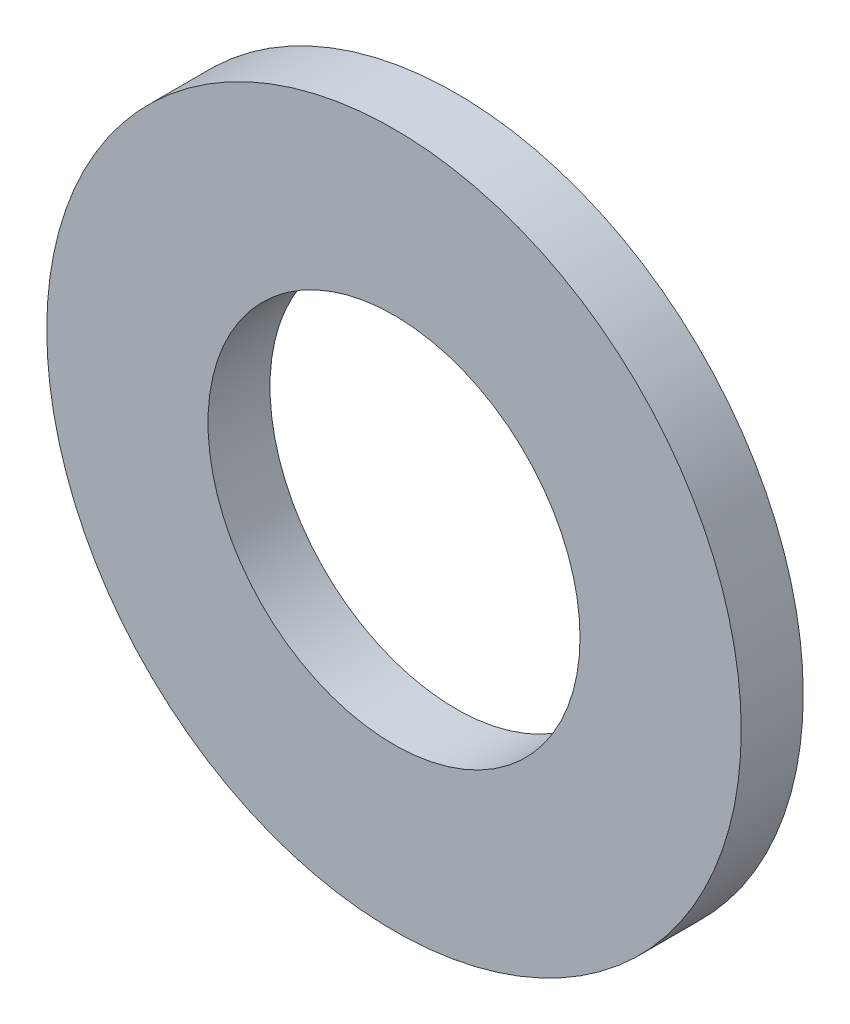
ISO-10303-21;
HEADER;
FILE_DESCRIPTION(('STEP AP214'),'2;1');
FILE_NAME('part.step','',(''),(''),'','','');
FILE_SCHEMA(('AUTOMOTIVE_DESIGN { 1 0 10303 214 1 1 1 1 }'));
ENDSEC;
DATA;
#1=APPLICATION_CONTEXT('core data for automotive mechanical design processes');
#2=APPLICATION_PROTOCOL_DEFINITION('international standard','automotive_design',2000,#1);
#3=PRODUCT_CONTEXT('',#1,'mechanical');
#4=PRODUCT('Part','Part','',(#3));
#5=PRODUCT_RELATED_PRODUCT_CATEGORY('part','',(#4));
#6=PRODUCT_DEFINITION_FORMATION('','',#4);
#7=PRODUCT_DEFINITION_CONTEXT('part definition',#1,'design');
#8=PRODUCT_DEFINITION('design','',#6,#7);
#9=PRODUCT_DEFINITION_SHAPE('','',#8);
#10=(LENGTH_UNIT() NAMED_UNIT(*) SI_UNIT(.MILLI.,.METRE.));
#11=(NAMED_UNIT(*) PLANE_ANGLE_UNIT() SI_UNIT($,.RADIAN.));
#12=(NAMED_UNIT(*) SI_UNIT($,.STERADIAN.) SOLID_ANGLE_UNIT());
#13=UNCERTAINTY_MEASURE_WITH_UNIT(LENGTH_MEASURE(1.E-05),#10,'distance_accuracy_value','');
#14=(GEOMETRIC_REPRESENTATION_CONTEXT(3) GLOBAL_UNCERTAINTY_ASSIGNED_CONTEXT((#13)) GLOBAL_UNIT_ASSIGNED_CONTEXT((#10,
#11,#12)) REPRESENTATION_CONTEXT('',''));
#15=CARTESIAN_POINT('',(0.,0.,0.));
#16=DIRECTION('',(0.,0.,1.));
#17=DIRECTION('',(1.,0.,0.));
#18=AXIS2_PLACEMENT_3D('',#15,#16,#17);
#19=CARTESIAN_POINT('',(0.,0.,-2.5));
#20=DIRECTION('',(0.,0.,1.));
#21=DIRECTION('',(1.,0.,0.));
#22=AXIS2_PLACEMENT_3D('',#19,#20,#21);
#23=CYLINDRICAL_SURFACE('',#22,14.);
#24=CARTESIAN_POINT('',(0.,0.,-2.5));
#25=DIRECTION('',(0.,0.,1.));
#26=DIRECTION('',(1.,0.,0.));
#27=AXIS2_PLACEMENT_3D('',#24,#25,#26);
#28=CIRCLE('',#27,14.);
#29=CARTESIAN_POINT('',(14.,0.,-2.5));
#30=VERTEX_POINT('',#29);
#31=EDGE_CURVE('E10',#30,#30,#28,.T.);
#32=ORIENTED_EDGE('',*,*,#31,.T.);
#33=EDGE_LOOP('',(#32));
#34=FACE_BOUND('',#33,.T.);
#35=CARTESIAN_POINT('',(0.,0.,0.));
#36=DIRECTION('',(0.,0.,1.));
#37=DIRECTION('',(1.,0.,0.));
#38=AXIS2_PLACEMENT_3D('',#35,#36,#37);
#39=CIRCLE('',#38,14.);
#40=CARTESIAN_POINT('',(14.,0.,0.));
#41=VERTEX_POINT('',#40);
#42=EDGE_CURVE('E34',#41,#41,#39,.T.);
#43=ORIENTED_EDGE('',*,*,#42,.F.);
#44=EDGE_LOOP('',(#43));
#45=FACE_BOUND('',#44,.T.);
#46=ADVANCED_FACE('F31',(#34,#45),#23,.T.);
#47=CARTESIAN_POINT('',(0.,0.,-2.5));
#48=DIRECTION('',(0.,0.,1.));
#49=DIRECTION('',(1.,0.,0.));
#50=AXIS2_PLACEMENT_3D('',#47,#48,#49);
#51=PLANE('',#50);
#52=CARTESIAN_POINT('',(0.,0.,-2.5));
#53=DIRECTION('',(0.,0.,1.));
#54=DIRECTION('',(1.,0.,0.));
#55=AXIS2_PLACEMENT_3D('',#52,#53,#54);
#56=CIRCLE('',#55,7.5);
#57=CARTESIAN_POINT('',(7.5,0.,-2.5));
#58=VERTEX_POINT('',#57);
#59=EDGE_CURVE('E41',#58,#58,#56,.T.);
#60=ORIENTED_EDGE('',*,*,#59,.T.);
#61=EDGE_LOOP('',(#60));
#62=FACE_BOUND('',#61,.T.);
#63=ORIENTED_EDGE('',*,*,#31,.F.);
#64=EDGE_LOOP('',(#63));
#65=FACE_BOUND('',#64,.T.);
#66=ADVANCED_FACE('F49',(#62,#65),#51,.F.);
#67=CARTESIAN_POINT('',(0.,0.,0.));
#68=DIRECTION('',(0.,0.,1.));
#69=DIRECTION('',(1.,0.,0.));
#70=AXIS2_PLACEMENT_3D('',#67,#68,#69);
#71=PLANE('',#70);
#72=CARTESIAN_POINT('',(0.,0.,0.));
#73=DIRECTION('',(0.,0.,1.));
#74=DIRECTION('',(1.,0.,0.));
#75=AXIS2_PLACEMENT_3D('',#72,#73,#74);
#76=CIRCLE('',#75,7.5);
#77=CARTESIAN_POINT('',(7.5,0.,0.));
#78=VERTEX_POINT('',#77);
#79=EDGE_CURVE('E43',#78,#78,#76,.T.);
#80=ORIENTED_EDGE('',*,*,#79,.F.);
#81=EDGE_LOOP('',(#80));
#82=FACE_BOUND('',#81,.T.);
#83=ORIENTED_EDGE('',*,*,#42,.T.);
#84=EDGE_LOOP('',(#83));
#85=FACE_BOUND('',#84,.T.);
#86=ADVANCED_FACE('F55',(#82,#85),#71,.T.);
#87=CARTESIAN_POINT('',(0.,0.,-2.5));
#88=DIRECTION('',(0.,0.,1.));
#89=DIRECTION('',(1.,0.,0.));
#90=AXIS2_PLACEMENT_3D('',#87,#88,#89);
#91=CYLINDRICAL_SURFACE('',#90,7.5);
#92=ORIENTED_EDGE('',*,*,#59,.F.);
#93=EDGE_LOOP('',(#92));
#94=FACE_BOUND('',#93,.T.);
#95=ORIENTED_EDGE('',*,*,#79,.T.);
#96=EDGE_LOOP('',(#95));
#97=FACE_BOUND('',#96,.T.);
#98=ADVANCED_FACE('F52',(#94,#97),#91,.F.);
#99=CLOSED_SHELL('',(#46,#66,#86,#98));
#100=MANIFOLD_SOLID_BREP('B2',#99);
#101=ADVANCED_BREP_SHAPE_REPRESENTATION('',(#18,#100),#14);
#102=SHAPE_DEFINITION_REPRESENTATION(#9,#101);
ENDSEC;
END-ISO-10303-21;
